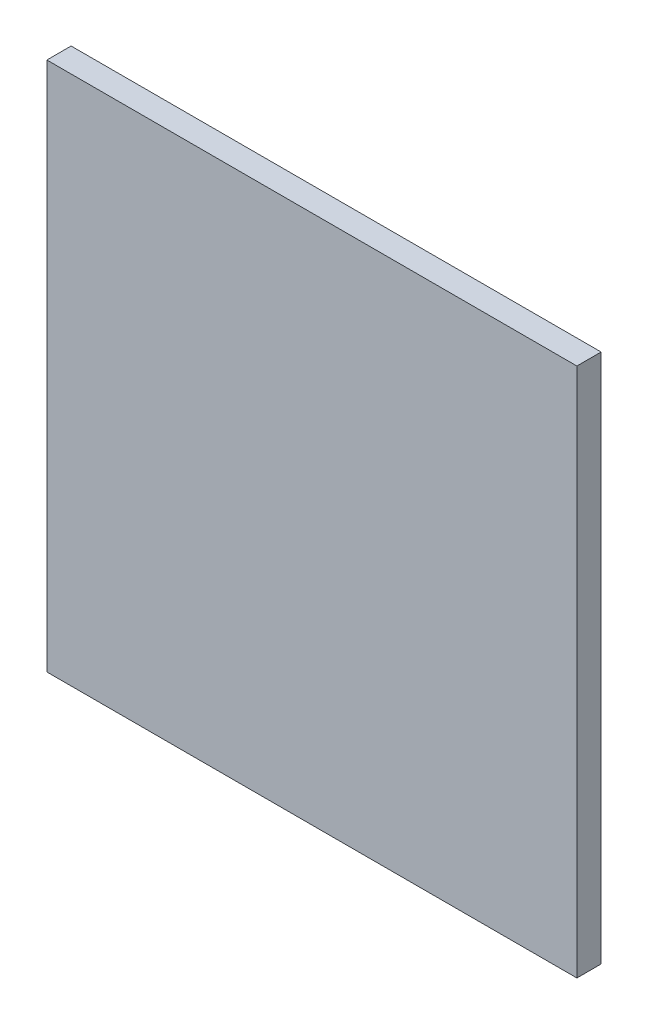
ISO-10303-21;
HEADER;
FILE_DESCRIPTION(('STEP AP214'),'2;1');
FILE_NAME('part.step','',(''),(''),'','','');
FILE_SCHEMA(('AUTOMOTIVE_DESIGN { 1 0 10303 214 1 1 1 1 }'));
ENDSEC;
DATA;
#1=APPLICATION_CONTEXT('core data for automotive mechanical design processes');
#2=APPLICATION_PROTOCOL_DEFINITION('international standard','automotive_design',2000,#1);
#3=PRODUCT_CONTEXT('',#1,'mechanical');
#4=PRODUCT('Part','Part','',(#3));
#5=PRODUCT_RELATED_PRODUCT_CATEGORY('part','',(#4));
#6=PRODUCT_DEFINITION_FORMATION('','',#4);
#7=PRODUCT_DEFINITION_CONTEXT('part definition',#1,'design');
#8=PRODUCT_DEFINITION('design','',#6,#7);
#9=PRODUCT_DEFINITION_SHAPE('','',#8);
#10=(LENGTH_UNIT() NAMED_UNIT(*) SI_UNIT(.MILLI.,.METRE.));
#11=(NAMED_UNIT(*) PLANE_ANGLE_UNIT() SI_UNIT($,.RADIAN.));
#12=(NAMED_UNIT(*) SI_UNIT($,.STERADIAN.) SOLID_ANGLE_UNIT());
#13=UNCERTAINTY_MEASURE_WITH_UNIT(LENGTH_MEASURE(1.E-05),#10,'distance_accuracy_value','');
#14=(GEOMETRIC_REPRESENTATION_CONTEXT(3) GLOBAL_UNCERTAINTY_ASSIGNED_CONTEXT((#13)) GLOBAL_UNIT_ASSIGNED_CONTEXT((#10,
#11,#12)) REPRESENTATION_CONTEXT('',''));
#15=CARTESIAN_POINT('',(0.,0.,0.));
#16=DIRECTION('',(0.,0.,1.));
#17=DIRECTION('',(1.,0.,0.));
#18=AXIS2_PLACEMENT_3D('',#15,#16,#17);
#19=CARTESIAN_POINT('',(-245.,245.,22.4));
#20=DIRECTION('',(1.,0.,0.));
#21=DIRECTION('',(0.,1.,0.));
#22=AXIS2_PLACEMENT_3D('',#19,#20,#21);
#23=PLANE('',#22);
#24=DIRECTION('',(0.,-1.,0.));
#25=VECTOR('',#24,1.);
#26=CARTESIAN_POINT('',(-245.,245.,0.));
#27=LINE('',#26,#25);
#28=CARTESIAN_POINT('',(-245.,245.,0.));
#29=VERTEX_POINT('',#28);
#30=CARTESIAN_POINT('',(-245.,-245.,0.));
#31=VERTEX_POINT('',#30);
#32=EDGE_CURVE('E94',#29,#31,#27,.T.);
#33=ORIENTED_EDGE('',*,*,#32,.T.);
#34=DIRECTION('',(0.,0.,-1.));
#35=VECTOR('',#34,1.);
#36=CARTESIAN_POINT('',(-245.,-245.,22.4));
#37=LINE('',#36,#35);
#38=CARTESIAN_POINT('',(-245.,-245.,22.4));
#39=VERTEX_POINT('',#38);
#40=EDGE_CURVE('E11',#39,#31,#37,.T.);
#41=ORIENTED_EDGE('',*,*,#40,.F.);
#42=DIRECTION('',(0.,-1.,0.));
#43=VECTOR('',#42,1.);
#44=CARTESIAN_POINT('',(-245.,245.,22.4));
#45=LINE('',#44,#43);
#46=CARTESIAN_POINT('',(-245.,245.,22.4));
#47=VERTEX_POINT('',#46);
#48=EDGE_CURVE('E82',#47,#39,#45,.T.);
#49=ORIENTED_EDGE('',*,*,#48,.F.);
#50=DIRECTION('',(0.,0.,-1.));
#51=VECTOR('',#50,1.);
#52=CARTESIAN_POINT('',(-245.,245.,22.4));
#53=LINE('',#52,#51);
#54=EDGE_CURVE('E90',#47,#29,#53,.T.);
#55=ORIENTED_EDGE('',*,*,#54,.T.);
#56=EDGE_LOOP('',(#33,#41,#49,#55));
#57=FACE_BOUND('',#56,.T.);
#58=ADVANCED_FACE('F31',(#57),#23,.F.);
#59=CARTESIAN_POINT('',(-245.,-245.,22.4));
#60=DIRECTION('',(0.,1.,0.));
#61=DIRECTION('',(0.,0.,1.));
#62=AXIS2_PLACEMENT_3D('',#59,#60,#61);
#63=PLANE('',#62);
#64=DIRECTION('',(1.,0.,0.));
#65=VECTOR('',#64,1.);
#66=CARTESIAN_POINT('',(-245.,-245.,0.));
#67=LINE('',#66,#65);
#68=CARTESIAN_POINT('',(245.,-245.,0.));
#69=VERTEX_POINT('',#68);
#70=EDGE_CURVE('E86',#31,#69,#67,.T.);
#71=ORIENTED_EDGE('',*,*,#70,.T.);
#72=DIRECTION('',(0.,0.,-1.));
#73=VECTOR('',#72,1.);
#74=CARTESIAN_POINT('',(245.,-245.,22.4));
#75=LINE('',#74,#73);
#76=CARTESIAN_POINT('',(245.,-245.,22.4));
#77=VERTEX_POINT('',#76);
#78=EDGE_CURVE('E39',#77,#69,#75,.T.);
#79=ORIENTED_EDGE('',*,*,#78,.F.);
#80=DIRECTION('',(1.,0.,0.));
#81=VECTOR('',#80,1.);
#82=CARTESIAN_POINT('',(-245.,-245.,22.4));
#83=LINE('',#82,#81);
#84=EDGE_CURVE('E77',#39,#77,#83,.T.);
#85=ORIENTED_EDGE('',*,*,#84,.F.);
#86=ORIENTED_EDGE('',*,*,#40,.T.);
#87=EDGE_LOOP('',(#71,#79,#85,#86));
#88=FACE_BOUND('',#87,.T.);
#89=ADVANCED_FACE('F85',(#88),#63,.F.);
#90=CARTESIAN_POINT('',(245.,245.,22.4));
#91=DIRECTION('',(-1.,0.,0.));
#92=DIRECTION('',(0.,-1.,0.));
#93=AXIS2_PLACEMENT_3D('',#90,#91,#92);
#94=PLANE('',#93);
#95=DIRECTION('',(0.,1.,0.));
#96=VECTOR('',#95,1.);
#97=CARTESIAN_POINT('',(245.,245.,0.));
#98=LINE('',#97,#96);
#99=CARTESIAN_POINT('',(245.,245.,0.));
#100=VERTEX_POINT('',#99);
#101=EDGE_CURVE('E64',#69,#100,#98,.T.);
#102=ORIENTED_EDGE('',*,*,#101,.T.);
#103=DIRECTION('',(0.,0.,-1.));
#104=VECTOR('',#103,1.);
#105=CARTESIAN_POINT('',(245.,245.,22.4));
#106=LINE('',#105,#104);
#107=CARTESIAN_POINT('',(245.,245.,22.4));
#108=VERTEX_POINT('',#107);
#109=EDGE_CURVE('E87',#108,#100,#106,.T.);
#110=ORIENTED_EDGE('',*,*,#109,.F.);
#111=DIRECTION('',(0.,1.,0.));
#112=VECTOR('',#111,1.);
#113=CARTESIAN_POINT('',(245.,245.,22.4));
#114=LINE('',#113,#112);
#115=EDGE_CURVE('E80',#77,#108,#114,.T.);
#116=ORIENTED_EDGE('',*,*,#115,.F.);
#117=ORIENTED_EDGE('',*,*,#78,.T.);
#118=EDGE_LOOP('',(#102,#110,#116,#117));
#119=FACE_BOUND('',#118,.T.);
#120=ADVANCED_FACE('F88',(#119),#94,.F.);
#121=CARTESIAN_POINT('',(-245.,245.,22.4));
#122=DIRECTION('',(0.,-1.,0.));
#123=DIRECTION('',(0.,0.,-1.));
#124=AXIS2_PLACEMENT_3D('',#121,#122,#123);
#125=PLANE('',#124);
#126=DIRECTION('',(-1.,0.,0.));
#127=VECTOR('',#126,1.);
#128=CARTESIAN_POINT('',(-245.,245.,0.));
#129=LINE('',#128,#127);
#130=EDGE_CURVE('E70',#100,#29,#129,.T.);
#131=ORIENTED_EDGE('',*,*,#130,.T.);
#132=ORIENTED_EDGE('',*,*,#54,.F.);
#133=DIRECTION('',(-1.,0.,0.));
#134=VECTOR('',#133,1.);
#135=CARTESIAN_POINT('',(-245.,245.,22.4));
#136=LINE('',#135,#134);
#137=EDGE_CURVE('E47',#108,#47,#136,.T.);
#138=ORIENTED_EDGE('',*,*,#137,.F.);
#139=ORIENTED_EDGE('',*,*,#109,.T.);
#140=EDGE_LOOP('',(#131,#132,#138,#139));
#141=FACE_BOUND('',#140,.T.);
#142=ADVANCED_FACE('F101',(#141),#125,.F.);
#143=CARTESIAN_POINT('',(-245.,-245.,22.4));
#144=DIRECTION('',(0.,0.,1.));
#145=DIRECTION('',(1.,0.,0.));
#146=AXIS2_PLACEMENT_3D('',#143,#144,#145);
#147=PLANE('',#146);
#148=ORIENTED_EDGE('',*,*,#48,.T.);
#149=ORIENTED_EDGE('',*,*,#84,.T.);
#150=ORIENTED_EDGE('',*,*,#115,.T.);
#151=ORIENTED_EDGE('',*,*,#137,.T.);
#152=EDGE_LOOP('',(#148,#149,#150,#151));
#153=FACE_BOUND('',#152,.T.);
#154=ADVANCED_FACE('F78',(#153),#147,.T.);
#155=CARTESIAN_POINT('',(-245.,-245.,0.));
#156=DIRECTION('',(0.,0.,1.));
#157=DIRECTION('',(1.,0.,0.));
#158=AXIS2_PLACEMENT_3D('',#155,#156,#157);
#159=PLANE('',#158);
#160=ORIENTED_EDGE('',*,*,#32,.F.);
#161=ORIENTED_EDGE('',*,*,#130,.F.);
#162=ORIENTED_EDGE('',*,*,#101,.F.);
#163=ORIENTED_EDGE('',*,*,#70,.F.);
#164=EDGE_LOOP('',(#160,#161,#162,#163));
#165=FACE_BOUND('',#164,.T.);
#166=ADVANCED_FACE('F104',(#165),#159,.F.);
#167=CLOSED_SHELL('',(#58,#89,#120,#142,#154,#166));
#168=MANIFOLD_SOLID_BREP('B2',#167);
#169=ADVANCED_BREP_SHAPE_REPRESENTATION('',(#18,#168),#14);
#170=SHAPE_DEFINITION_REPRESENTATION(#9,#169);
ENDSEC;
END-ISO-10303-21;
